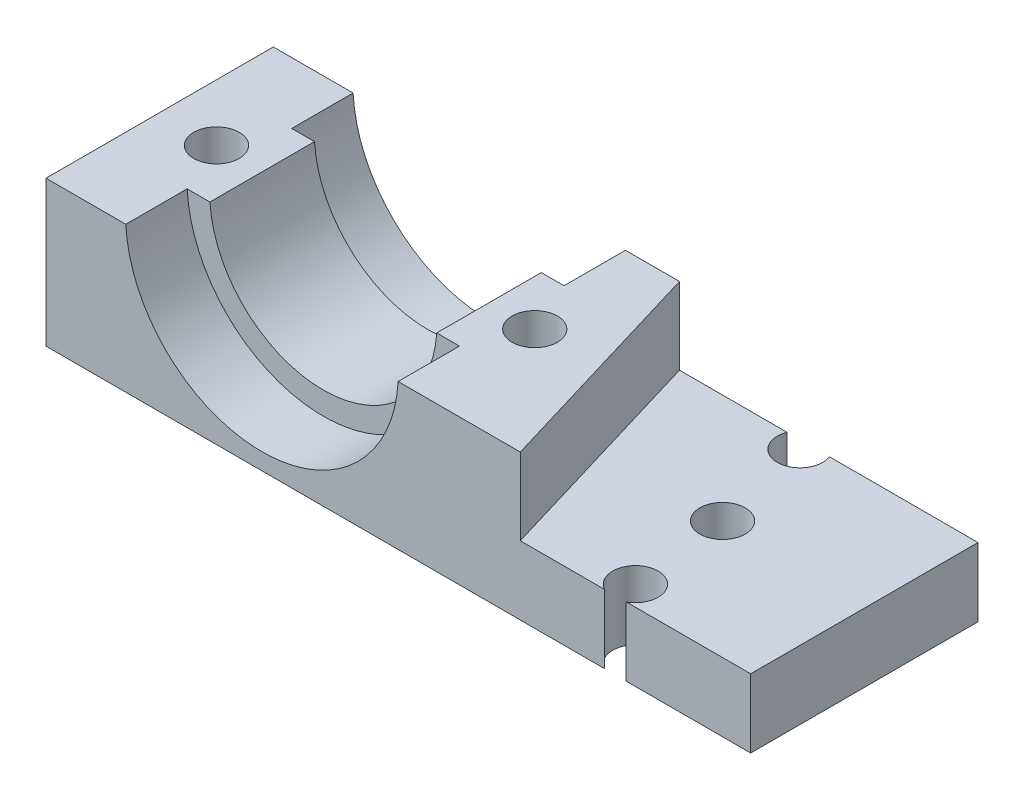
ISO-10303-21;
HEADER;
FILE_DESCRIPTION(('STEP AP214'),'2;1');
FILE_NAME('part.step','',(''),(''),'','','');
FILE_SCHEMA(('AUTOMOTIVE_DESIGN { 1 0 10303 214 1 1 1 1 }'));
ENDSEC;
DATA;
#1=APPLICATION_CONTEXT('core data for automotive mechanical design processes');
#2=APPLICATION_PROTOCOL_DEFINITION('international standard','automotive_design',2000,#1);
#3=PRODUCT_CONTEXT('',#1,'mechanical');
#4=PRODUCT('Part','Part','',(#3));
#5=PRODUCT_RELATED_PRODUCT_CATEGORY('part','',(#4));
#6=PRODUCT_DEFINITION_FORMATION('','',#4);
#7=PRODUCT_DEFINITION_CONTEXT('part definition',#1,'design');
#8=PRODUCT_DEFINITION('design','',#6,#7);
#9=PRODUCT_DEFINITION_SHAPE('','',#8);
#10=(LENGTH_UNIT() NAMED_UNIT(*) SI_UNIT(.MILLI.,.METRE.));
#11=(NAMED_UNIT(*) PLANE_ANGLE_UNIT() SI_UNIT($,.RADIAN.));
#12=(NAMED_UNIT(*) SI_UNIT($,.STERADIAN.) SOLID_ANGLE_UNIT());
#13=UNCERTAINTY_MEASURE_WITH_UNIT(LENGTH_MEASURE(1.E-05),#10,'distance_accuracy_value','');
#14=(GEOMETRIC_REPRESENTATION_CONTEXT(3) GLOBAL_UNCERTAINTY_ASSIGNED_CONTEXT((#13)) GLOBAL_UNIT_ASSIGNED_CONTEXT((#10,
#11,#12)) REPRESENTATION_CONTEXT('',''));
#15=CARTESIAN_POINT('',(0.,0.,0.));
#16=DIRECTION('',(0.,0.,1.));
#17=DIRECTION('',(1.,0.,0.));
#18=AXIS2_PLACEMENT_3D('',#15,#16,#17);
#19=CARTESIAN_POINT('',(47.5,16.,-25.));
#20=DIRECTION('',(0.,0.,1.));
#21=DIRECTION('',(0.,-1.,0.));
#22=AXIS2_PLACEMENT_3D('',#19,#20,#21);
#23=PLANE('',#22);
#24=DIRECTION('',(-1.,0.,0.));
#25=VECTOR('',#24,1.);
#26=CARTESIAN_POINT('',(47.5,-0.899999999999998,-25.));
#27=LINE('',#26,#25);
#28=CARTESIAN_POINT('',(107.5,-0.899999999999998,-25.));
#29=VERTEX_POINT('',#28);
#30=CARTESIAN_POINT('',(74.8242576944994,-0.899999999999998,-25.));
#31=VERTEX_POINT('',#30);
#32=EDGE_CURVE('E50',#29,#31,#27,.T.);
#33=ORIENTED_EDGE('',*,*,#32,.F.);
#34=DIRECTION('',(0.,1.,0.));
#35=VECTOR('',#34,1.);
#36=CARTESIAN_POINT('',(107.5,-16.,-25.));
#37=LINE('',#36,#35);
#38=CARTESIAN_POINT('',(107.5,-16.,-25.));
#39=VERTEX_POINT('',#38);
#40=EDGE_CURVE('E270',#39,#29,#37,.T.);
#41=ORIENTED_EDGE('',*,*,#40,.F.);
#42=DIRECTION('',(-1.,0.,0.));
#43=VECTOR('',#42,1.);
#44=CARTESIAN_POINT('',(47.5,-16.,-25.));
#45=LINE('',#44,#43);
#46=CARTESIAN_POINT('',(74.8242576944994,-16.,-25.));
#47=VERTEX_POINT('',#46);
#48=EDGE_CURVE('E171',#39,#47,#45,.T.);
#49=ORIENTED_EDGE('',*,*,#48,.T.);
#50=DIRECTION('',(0.,1.,0.));
#51=VECTOR('',#50,1.);
#52=CARTESIAN_POINT('',(74.8242576944994,-59.,-25.));
#53=LINE('',#52,#51);
#54=EDGE_CURVE('E219',#47,#31,#53,.T.);
#55=ORIENTED_EDGE('',*,*,#54,.T.);
#56=EDGE_LOOP('',(#33,#41,#49,#55));
#57=FACE_BOUND('',#56,.T.);
#58=ADVANCED_FACE('F35',(#57),#23,.F.);
#59=CARTESIAN_POINT('',(47.5,16.,25.));
#60=DIRECTION('',(0.,0.,-1.));
#61=DIRECTION('',(0.,1.,0.));
#62=AXIS2_PLACEMENT_3D('',#59,#60,#61);
#63=PLANE('',#62);
#64=DIRECTION('',(1.,0.,0.));
#65=VECTOR('',#64,1.);
#66=CARTESIAN_POINT('',(47.5,-0.899999999999998,25.));
#67=LINE('',#66,#65);
#68=CARTESIAN_POINT('',(80.1248684174076,-0.899999999999998,25.));
#69=VERTEX_POINT('',#68);
#70=CARTESIAN_POINT('',(107.5,-0.899999999999998,25.));
#71=VERTEX_POINT('',#70);
#72=EDGE_CURVE('E297',#69,#71,#67,.T.);
#73=ORIENTED_EDGE('',*,*,#72,.F.);
#74=DIRECTION('',(0.,1.,0.));
#75=VECTOR('',#74,1.);
#76=CARTESIAN_POINT('',(80.1248684174076,-59.,25.));
#77=LINE('',#76,#75);
#78=CARTESIAN_POINT('',(80.1248684174076,-16.,25.));
#79=VERTEX_POINT('',#78);
#80=EDGE_CURVE('E216',#69,#79,#77,.F.);
#81=ORIENTED_EDGE('',*,*,#80,.T.);
#82=DIRECTION('',(-1.,0.,0.));
#83=VECTOR('',#82,1.);
#84=CARTESIAN_POINT('',(47.5,-16.,25.));
#85=LINE('',#84,#83);
#86=CARTESIAN_POINT('',(107.5,-16.,25.));
#87=VERTEX_POINT('',#86);
#88=EDGE_CURVE('E178',#87,#79,#85,.T.);
#89=ORIENTED_EDGE('',*,*,#88,.F.);
#90=DIRECTION('',(0.,-1.,0.));
#91=VECTOR('',#90,1.);
#92=CARTESIAN_POINT('',(107.5,16.,25.));
#93=LINE('',#92,#91);
#94=EDGE_CURVE('E276',#71,#87,#93,.T.);
#95=ORIENTED_EDGE('',*,*,#94,.F.);
#96=EDGE_LOOP('',(#73,#81,#89,#95));
#97=FACE_BOUND('',#96,.T.);
#98=ADVANCED_FACE('F37',(#97),#63,.F.);
#99=CARTESIAN_POINT('',(107.5,0.,0.));
#100=DIRECTION('',(1.,0.,0.));
#101=DIRECTION('',(0.,0.,-1.));
#102=AXIS2_PLACEMENT_3D('',#99,#100,#101);
#103=PLANE('',#102);
#104=ORIENTED_EDGE('',*,*,#40,.T.);
#105=DIRECTION('',(0.,0.,1.));
#106=VECTOR('',#105,1.);
#107=CARTESIAN_POINT('',(107.5,-0.899999999999998,0.));
#108=LINE('',#107,#106);
#109=EDGE_CURVE('E299',#29,#71,#108,.T.);
#110=ORIENTED_EDGE('',*,*,#109,.T.);
#111=ORIENTED_EDGE('',*,*,#94,.T.);
#112=DIRECTION('',(0.,0.,-1.));
#113=VECTOR('',#112,1.);
#114=CARTESIAN_POINT('',(107.5,-16.,25.));
#115=LINE('',#114,#113);
#116=EDGE_CURVE('E273',#87,#39,#115,.T.);
#117=ORIENTED_EDGE('',*,*,#116,.T.);
#118=EDGE_LOOP('',(#104,#110,#111,#117));
#119=FACE_BOUND('',#118,.T.);
#120=ADVANCED_FACE('F318',(#119),#103,.T.);
#121=CARTESIAN_POINT('',(77.75,-59.,20.6));
#122=DIRECTION('',(0.,1.,0.));
#123=DIRECTION('',(0.,0.,1.));
#124=AXIS2_PLACEMENT_3D('',#121,#122,#123);
#125=CYLINDRICAL_SURFACE('',#124,5.);
#126=CARTESIAN_POINT('',(77.75,-0.899999999999998,20.6));
#127=DIRECTION('',(0.,1.,0.));
#128=DIRECTION('',(0.,0.,1.));
#129=AXIS2_PLACEMENT_3D('',#126,#127,#128);
#130=CIRCLE('',#129,5.);
#131=CARTESIAN_POINT('',(75.3751315825924,-0.899999999999998,25.));
#132=VERTEX_POINT('',#131);
#133=EDGE_CURVE('E295',#132,#69,#130,.F.);
#134=ORIENTED_EDGE('',*,*,#133,.F.);
#135=DIRECTION('',(0.,1.,0.));
#136=VECTOR('',#135,1.);
#137=CARTESIAN_POINT('',(75.3751315825924,-59.,25.));
#138=LINE('',#137,#136);
#139=CARTESIAN_POINT('',(75.3751315825924,-16.,25.));
#140=VERTEX_POINT('',#139);
#141=EDGE_CURVE('E285',#140,#132,#138,.T.);
#142=ORIENTED_EDGE('',*,*,#141,.F.);
#143=CARTESIAN_POINT('',(77.75,-16.,20.6));
#144=DIRECTION('',(0.,1.,0.));
#145=DIRECTION('',(0.,0.,1.));
#146=AXIS2_PLACEMENT_3D('',#143,#144,#145);
#147=CIRCLE('',#146,5.);
#148=EDGE_CURVE('E205',#79,#140,#147,.T.);
#149=ORIENTED_EDGE('',*,*,#148,.F.);
#150=ORIENTED_EDGE('',*,*,#80,.F.);
#151=EDGE_LOOP('',(#134,#142,#149,#150));
#152=FACE_BOUND('',#151,.T.);
#153=ADVANCED_FACE('F310',(#152),#125,.F.);
#154=CARTESIAN_POINT('',(75.2958783952514,-59.,-1.01110333021213));
#155=DIRECTION('',(0.,1.,0.));
#156=DIRECTION('',(0.,0.,1.));
#157=AXIS2_PLACEMENT_3D('',#154,#155,#156);
#158=CYLINDRICAL_SURFACE('',#157,5.);
#159=CARTESIAN_POINT('',(75.2958783952514,-16.,-1.01110333021213));
#160=DIRECTION('',(0.,1.,0.));
#161=DIRECTION('',(0.,0.,1.));
#162=AXIS2_PLACEMENT_3D('',#159,#160,#161);
#163=CIRCLE('',#162,5.);
#164=CARTESIAN_POINT('',(75.2958783952514,-16.,3.98889666978787));
#165=VERTEX_POINT('',#164);
#166=EDGE_CURVE('E213',#165,#165,#163,.T.);
#167=ORIENTED_EDGE('',*,*,#166,.F.);
#168=EDGE_LOOP('',(#167));
#169=FACE_BOUND('',#168,.T.);
#170=CARTESIAN_POINT('',(75.2958783952514,-0.899999999999998,-1.01110333021213));
#171=DIRECTION('',(0.,1.,0.));
#172=DIRECTION('',(0.,0.,1.));
#173=AXIS2_PLACEMENT_3D('',#170,#171,#172);
#174=CIRCLE('',#173,5.);
#175=CARTESIAN_POINT('',(75.2958783952514,-0.899999999999998,3.98889666978787));
#176=VERTEX_POINT('',#175);
#177=EDGE_CURVE('E290',#176,#176,#174,.F.);
#178=ORIENTED_EDGE('',*,*,#177,.F.);
#179=EDGE_LOOP('',(#178));
#180=FACE_BOUND('',#179,.T.);
#181=ADVANCED_FACE('F457',(#169,#180),#158,.F.);
#182=CARTESIAN_POINT('',(70.16399597534,-59.,-23.1883817430436));
#183=DIRECTION('',(0.,1.,0.));
#184=DIRECTION('',(0.,0.,1.));
#185=AXIS2_PLACEMENT_3D('',#182,#183,#184);
#186=CYLINDRICAL_SURFACE('',#185,5.);
#187=CARTESIAN_POINT('',(70.16399597534,-0.899999999999998,-23.1883817430436));
#188=DIRECTION('',(0.,1.,0.));
#189=DIRECTION('',(0.,0.,1.));
#190=AXIS2_PLACEMENT_3D('',#187,#188,#189);
#191=CIRCLE('',#190,5.);
#192=CARTESIAN_POINT('',(65.5037342561806,-0.899999999999998,-25.));
#193=VERTEX_POINT('',#192);
#194=EDGE_CURVE('E43',#31,#193,#191,.F.);
#195=ORIENTED_EDGE('',*,*,#194,.F.);
#196=ORIENTED_EDGE('',*,*,#54,.F.);
#197=CARTESIAN_POINT('',(70.16399597534,-16.,-23.1883817430436));
#198=DIRECTION('',(0.,1.,0.));
#199=DIRECTION('',(0.,0.,1.));
#200=AXIS2_PLACEMENT_3D('',#197,#198,#199);
#201=CIRCLE('',#200,5.);
#202=CARTESIAN_POINT('',(65.5037342561806,-16.,-25.));
#203=VERTEX_POINT('',#202);
#204=EDGE_CURVE('E217',#203,#47,#201,.T.);
#205=ORIENTED_EDGE('',*,*,#204,.F.);
#206=DIRECTION('',(0.,1.,0.));
#207=VECTOR('',#206,1.);
#208=CARTESIAN_POINT('',(65.5037342561806,-59.,-25.));
#209=LINE('',#208,#207);
#210=EDGE_CURVE('E58',#193,#203,#209,.F.);
#211=ORIENTED_EDGE('',*,*,#210,.F.);
#212=EDGE_LOOP('',(#195,#196,#205,#211));
#213=FACE_BOUND('',#212,.T.);
#214=ADVANCED_FACE('F226',(#213),#186,.F.);
#215=DIRECTION('',(1.,0.,0.));
#216=VECTOR('',#215,1.);
#217=CARTESIAN_POINT('',(47.5,-0.899999999999998,25.));
#218=LINE('',#217,#216);
#219=CARTESIAN_POINT('',(56.8274489065329,-0.899999999999998,25.));
#220=VERTEX_POINT('',#219);
#221=EDGE_CURVE('E293',#220,#132,#218,.T.);
#222=ORIENTED_EDGE('',*,*,#221,.F.);
#223=DIRECTION('',(0.,1.,0.));
#224=VECTOR('',#223,1.);
#225=CARTESIAN_POINT('',(56.8274489065329,16.,25.));
#226=LINE('',#225,#224);
#227=CARTESIAN_POINT('',(56.8274489065329,16.,25.));
#228=VERTEX_POINT('',#227);
#229=EDGE_CURVE('E230',#220,#228,#226,.T.);
#230=ORIENTED_EDGE('',*,*,#229,.T.);
#231=DIRECTION('',(-1.,0.,0.));
#232=VECTOR('',#231,1.);
#233=CARTESIAN_POINT('',(47.5,16.,25.));
#234=LINE('',#233,#232);
#235=CARTESIAN_POINT('',(29.9545906331567,16.,25.));
#236=VERTEX_POINT('',#235);
#237=EDGE_CURVE('E162',#228,#236,#234,.T.);
#238=ORIENTED_EDGE('',*,*,#237,.T.);
#239=CARTESIAN_POINT('',(0.,17.6500000000001,25.));
#240=DIRECTION('',(0.,0.,1.));
#241=DIRECTION('',(1.,0.,0.));
#242=AXIS2_PLACEMENT_3D('',#239,#240,#241);
#243=CIRCLE('',#242,30.);
#244=CARTESIAN_POINT('',(-29.9545906331567,16.,25.));
#245=VERTEX_POINT('',#244);
#246=EDGE_CURVE('E254',#245,#236,#243,.T.);
#247=ORIENTED_EDGE('',*,*,#246,.F.);
#248=CARTESIAN_POINT('',(-47.5,16.,25.));
#249=VERTEX_POINT('',#248);
#250=EDGE_CURVE('E250',#245,#249,#234,.T.);
#251=ORIENTED_EDGE('',*,*,#250,.T.);
#252=DIRECTION('',(0.,-1.,0.));
#253=VECTOR('',#252,1.);
#254=CARTESIAN_POINT('',(-47.5,16.,25.));
#255=LINE('',#254,#253);
#256=CARTESIAN_POINT('',(-47.5,-16.,25.));
#257=VERTEX_POINT('',#256);
#258=EDGE_CURVE('E247',#249,#257,#255,.T.);
#259=ORIENTED_EDGE('',*,*,#258,.T.);
#260=EDGE_CURVE('E177',#140,#257,#85,.T.);
#261=ORIENTED_EDGE('',*,*,#260,.F.);
#262=ORIENTED_EDGE('',*,*,#141,.T.);
#263=EDGE_LOOP('',(#222,#230,#238,#247,#251,#259,#261,#262));
#264=FACE_BOUND('',#263,.T.);
#265=ADVANCED_FACE('F306',(#264),#63,.F.);
#266=CARTESIAN_POINT('',(47.5,16.,25.));
#267=DIRECTION('',(0.,-1.,0.));
#268=DIRECTION('',(0.,0.,-1.));
#269=AXIS2_PLACEMENT_3D('',#266,#267,#268);
#270=PLANE('',#269);
#271=CARTESIAN_POINT('',(35.,16.,0.));
#272=DIRECTION('',(0.,1.,0.));
#273=DIRECTION('',(0.,0.,1.));
#274=AXIS2_PLACEMENT_3D('',#271,#272,#273);
#275=CIRCLE('',#274,5.);
#276=CARTESIAN_POINT('',(35.,16.,4.99999999999998));
#277=VERTEX_POINT('',#276);
#278=EDGE_CURVE('E210',#277,#277,#275,.T.);
#279=ORIENTED_EDGE('',*,*,#278,.F.);
#280=EDGE_LOOP('',(#279));
#281=FACE_BOUND('',#280,.T.);
#282=ORIENTED_EDGE('',*,*,#237,.F.);
#283=DIRECTION('',(0.287073177950389,0.,0.957908654570708));
#284=VECTOR('',#283,1.);
#285=CARTESIAN_POINT('',(97.4111695597761,16.,160.420165429526));
#286=LINE('',#285,#284);
#287=CARTESIAN_POINT('',(41.8430776629595,16.,-25.));
#288=VERTEX_POINT('',#287);
#289=EDGE_CURVE('E150',#288,#228,#286,.T.);
#290=ORIENTED_EDGE('',*,*,#289,.F.);
#291=DIRECTION('',(-1.,0.,0.));
#292=VECTOR('',#291,1.);
#293=CARTESIAN_POINT('',(47.5,16.,-25.));
#294=LINE('',#293,#292);
#295=CARTESIAN_POINT('',(29.9545906331567,16.,-25.));
#296=VERTEX_POINT('',#295);
#297=EDGE_CURVE('E159',#288,#296,#294,.T.);
#298=ORIENTED_EDGE('',*,*,#297,.T.);
#299=DIRECTION('',(0.,0.,1.));
#300=VECTOR('',#299,1.);
#301=CARTESIAN_POINT('',(29.9545906331567,16.,-20.2491264575217));
#302=LINE('',#301,#300);
#303=CARTESIAN_POINT('',(29.9545906331567,16.,-11.5));
#304=VERTEX_POINT('',#303);
#305=EDGE_CURVE('E198',#296,#304,#302,.T.);
#306=ORIENTED_EDGE('',*,*,#305,.T.);
#307=DIRECTION('',(-1.,0.,0.));
#308=VECTOR('',#307,1.);
#309=CARTESIAN_POINT('',(47.5,16.,-11.5));
#310=LINE('',#309,#308);
#311=CARTESIAN_POINT('',(24.9454905744505,16.,-11.5));
#312=VERTEX_POINT('',#311);
#313=EDGE_CURVE('E188',#304,#312,#310,.T.);
#314=ORIENTED_EDGE('',*,*,#313,.T.);
#315=DIRECTION('',(0.,0.,1.));
#316=VECTOR('',#315,1.);
#317=CARTESIAN_POINT('',(24.9454905744505,16.,-20.2491264575217));
#318=LINE('',#317,#316);
#319=CARTESIAN_POINT('',(24.9454905744505,16.,11.5));
#320=VERTEX_POINT('',#319);
#321=EDGE_CURVE('E200',#312,#320,#318,.T.);
#322=ORIENTED_EDGE('',*,*,#321,.T.);
#323=DIRECTION('',(1.,0.,0.));
#324=VECTOR('',#323,1.);
#325=CARTESIAN_POINT('',(47.5,16.,11.5));
#326=LINE('',#325,#324);
#327=CARTESIAN_POINT('',(29.9545906331567,16.,11.5));
#328=VERTEX_POINT('',#327);
#329=EDGE_CURVE('E195',#320,#328,#326,.T.);
#330=ORIENTED_EDGE('',*,*,#329,.T.);
#331=DIRECTION('',(0.,0.,1.));
#332=VECTOR('',#331,1.);
#333=CARTESIAN_POINT('',(29.9545906331567,16.,-20.2491264575217));
#334=LINE('',#333,#332);
#335=EDGE_CURVE('E203',#328,#236,#334,.T.);
#336=ORIENTED_EDGE('',*,*,#335,.T.);
#337=EDGE_LOOP('',(#282,#290,#298,#306,#314,#322,#330,#336));
#338=FACE_BOUND('',#337,.T.);
#339=ADVANCED_FACE('F157',(#281,#338),#270,.F.);
#340=CARTESIAN_POINT('',(47.5,-16.,25.));
#341=DIRECTION('',(0.,1.,0.));
#342=DIRECTION('',(0.,0.,1.));
#343=AXIS2_PLACEMENT_3D('',#340,#341,#342);
#344=PLANE('',#343);
#345=ORIENTED_EDGE('',*,*,#166,.T.);
#346=EDGE_LOOP('',(#345));
#347=FACE_BOUND('',#346,.T.);
#348=CARTESIAN_POINT('',(35.,-16.,0.));
#349=DIRECTION('',(0.,1.,0.));
#350=DIRECTION('',(0.,0.,1.));
#351=AXIS2_PLACEMENT_3D('',#348,#349,#350);
#352=CIRCLE('',#351,5.);
#353=CARTESIAN_POINT('',(35.,-16.,4.99999999999998));
#354=VERTEX_POINT('',#353);
#355=EDGE_CURVE('E206',#354,#354,#352,.T.);
#356=ORIENTED_EDGE('',*,*,#355,.T.);
#357=EDGE_LOOP('',(#356));
#358=FACE_BOUND('',#357,.T.);
#359=CARTESIAN_POINT('',(-35.,-16.,0.));
#360=DIRECTION('',(0.,1.,0.));
#361=DIRECTION('',(0.,0.,1.));
#362=AXIS2_PLACEMENT_3D('',#359,#360,#361);
#363=CIRCLE('',#362,5.);
#364=CARTESIAN_POINT('',(-35.,-16.,5.));
#365=VERTEX_POINT('',#364);
#366=EDGE_CURVE('E278',#365,#365,#363,.T.);
#367=ORIENTED_EDGE('',*,*,#366,.T.);
#368=EDGE_LOOP('',(#367));
#369=FACE_BOUND('',#368,.T.);
#370=CARTESIAN_POINT('',(-47.5,-16.,-25.));
#371=VERTEX_POINT('',#370);
#372=EDGE_CURVE('E168',#203,#371,#45,.T.);
#373=ORIENTED_EDGE('',*,*,#372,.F.);
#374=ORIENTED_EDGE('',*,*,#204,.T.);
#375=ORIENTED_EDGE('',*,*,#48,.F.);
#376=ORIENTED_EDGE('',*,*,#116,.F.);
#377=ORIENTED_EDGE('',*,*,#88,.T.);
#378=ORIENTED_EDGE('',*,*,#148,.T.);
#379=ORIENTED_EDGE('',*,*,#260,.T.);
#380=DIRECTION('',(0.,0.,-1.));
#381=VECTOR('',#380,1.);
#382=CARTESIAN_POINT('',(-47.5,-16.,25.));
#383=LINE('',#382,#381);
#384=EDGE_CURVE('E235',#257,#371,#383,.T.);
#385=ORIENTED_EDGE('',*,*,#384,.T.);
#386=EDGE_LOOP('',(#373,#374,#375,#376,#377,#378,#379,#385));
#387=FACE_BOUND('',#386,.T.);
#388=ADVANCED_FACE('F233',(#347,#358,#369,#387),#344,.F.);
#389=ORIENTED_EDGE('',*,*,#297,.F.);
#390=DIRECTION('',(0.,-1.,0.));
#391=VECTOR('',#390,1.);
#392=CARTESIAN_POINT('',(41.8430776629595,16.,-25.));
#393=LINE('',#392,#391);
#394=CARTESIAN_POINT('',(41.8430776629595,-0.899999999999998,-25.));
#395=VERTEX_POINT('',#394);
#396=EDGE_CURVE('E11',#288,#395,#393,.T.);
#397=ORIENTED_EDGE('',*,*,#396,.T.);
#398=DIRECTION('',(-1.,0.,0.));
#399=VECTOR('',#398,1.);
#400=CARTESIAN_POINT('',(47.5,-0.899999999999998,-25.));
#401=LINE('',#400,#399);
#402=EDGE_CURVE('E223',#193,#395,#401,.T.);
#403=ORIENTED_EDGE('',*,*,#402,.F.);
#404=ORIENTED_EDGE('',*,*,#210,.T.);
#405=ORIENTED_EDGE('',*,*,#372,.T.);
#406=DIRECTION('',(0.,1.,0.));
#407=VECTOR('',#406,1.);
#408=CARTESIAN_POINT('',(-47.5,16.,-25.));
#409=LINE('',#408,#407);
#410=CARTESIAN_POINT('',(-47.5,16.,-25.));
#411=VERTEX_POINT('',#410);
#412=EDGE_CURVE('E238',#371,#411,#409,.T.);
#413=ORIENTED_EDGE('',*,*,#412,.T.);
#414=CARTESIAN_POINT('',(-29.9545906331567,16.,-25.));
#415=VERTEX_POINT('',#414);
#416=EDGE_CURVE('E169',#415,#411,#294,.T.);
#417=ORIENTED_EDGE('',*,*,#416,.F.);
#418=CARTESIAN_POINT('',(0.,17.6500000000001,-25.));
#419=DIRECTION('',(0.,0.,1.));
#420=DIRECTION('',(1.,0.,0.));
#421=AXIS2_PLACEMENT_3D('',#418,#419,#420);
#422=CIRCLE('',#421,30.);
#423=EDGE_CURVE('E167',#415,#296,#422,.T.);
#424=ORIENTED_EDGE('',*,*,#423,.T.);
#425=EDGE_LOOP('',(#389,#397,#403,#404,#405,#413,#417,#424));
#426=FACE_BOUND('',#425,.T.);
#427=ADVANCED_FACE('F165',(#426),#23,.F.);
#428=CARTESIAN_POINT('',(-35.,16.,0.));
#429=DIRECTION('',(0.,1.,0.));
#430=DIRECTION('',(0.,0.,1.));
#431=AXIS2_PLACEMENT_3D('',#428,#429,#430);
#432=CIRCLE('',#431,5.);
#433=CARTESIAN_POINT('',(-35.,16.,5.));
#434=VERTEX_POINT('',#433);
#435=EDGE_CURVE('E209',#434,#434,#432,.T.);
#436=ORIENTED_EDGE('',*,*,#435,.F.);
#437=EDGE_LOOP('',(#436));
#438=FACE_BOUND('',#437,.T.);
#439=ORIENTED_EDGE('',*,*,#250,.F.);
#440=DIRECTION('',(0.,0.,1.));
#441=VECTOR('',#440,1.);
#442=CARTESIAN_POINT('',(-29.9545906331567,16.,-20.2491264575217));
#443=LINE('',#442,#441);
#444=CARTESIAN_POINT('',(-29.9545906331567,16.,11.5));
#445=VERTEX_POINT('',#444);
#446=EDGE_CURVE('E194',#245,#445,#443,.F.);
#447=ORIENTED_EDGE('',*,*,#446,.T.);
#448=CARTESIAN_POINT('',(-24.9454905744505,16.,11.5));
#449=VERTEX_POINT('',#448);
#450=EDGE_CURVE('E191',#445,#449,#326,.T.);
#451=ORIENTED_EDGE('',*,*,#450,.T.);
#452=DIRECTION('',(0.,0.,1.));
#453=VECTOR('',#452,1.);
#454=CARTESIAN_POINT('',(-24.9454905744505,16.,-20.2491264575217));
#455=LINE('',#454,#453);
#456=CARTESIAN_POINT('',(-24.9454905744505,16.,-11.5));
#457=VERTEX_POINT('',#456);
#458=EDGE_CURVE('E187',#449,#457,#455,.F.);
#459=ORIENTED_EDGE('',*,*,#458,.T.);
#460=CARTESIAN_POINT('',(-29.9545906331567,16.,-11.5));
#461=VERTEX_POINT('',#460);
#462=EDGE_CURVE('E184',#457,#461,#310,.T.);
#463=ORIENTED_EDGE('',*,*,#462,.T.);
#464=DIRECTION('',(0.,0.,1.));
#465=VECTOR('',#464,1.);
#466=CARTESIAN_POINT('',(-29.9545906331567,16.,-20.2491264575217));
#467=LINE('',#466,#465);
#468=EDGE_CURVE('E181',#461,#415,#467,.F.);
#469=ORIENTED_EDGE('',*,*,#468,.T.);
#470=ORIENTED_EDGE('',*,*,#416,.T.);
#471=DIRECTION('',(0.,0.,1.));
#472=VECTOR('',#471,1.);
#473=CARTESIAN_POINT('',(-47.5,16.,25.));
#474=LINE('',#473,#472);
#475=EDGE_CURVE('E241',#411,#249,#474,.T.);
#476=ORIENTED_EDGE('',*,*,#475,.T.);
#477=EDGE_LOOP('',(#439,#447,#451,#459,#463,#469,#470,#476));
#478=FACE_BOUND('',#477,.T.);
#479=ADVANCED_FACE('F328',(#438,#478),#270,.F.);
#480=CARTESIAN_POINT('',(-47.5,0.,0.));
#481=DIRECTION('',(1.,0.,0.));
#482=DIRECTION('',(0.,0.,-1.));
#483=AXIS2_PLACEMENT_3D('',#480,#481,#482);
#484=PLANE('',#483);
#485=ORIENTED_EDGE('',*,*,#258,.F.);
#486=ORIENTED_EDGE('',*,*,#475,.F.);
#487=ORIENTED_EDGE('',*,*,#412,.F.);
#488=ORIENTED_EDGE('',*,*,#384,.F.);
#489=EDGE_LOOP('',(#485,#486,#487,#488));
#490=FACE_BOUND('',#489,.T.);
#491=ADVANCED_FACE('F245',(#490),#484,.F.);
#492=CARTESIAN_POINT('',(0.,17.6500000000001,-20.2491264575217));
#493=DIRECTION('',(0.,0.,1.));
#494=DIRECTION('',(1.,0.,0.));
#495=AXIS2_PLACEMENT_3D('',#492,#493,#494);
#496=CYLINDRICAL_SURFACE('',#495,30.);
#497=CARTESIAN_POINT('',(0.,17.6500000000001,11.5));
#498=DIRECTION('',(0.,0.,1.));
#499=DIRECTION('',(1.,0.,0.));
#500=AXIS2_PLACEMENT_3D('',#497,#498,#499);
#501=CIRCLE('',#500,30.);
#502=EDGE_CURVE('E257',#445,#328,#501,.T.);
#503=ORIENTED_EDGE('',*,*,#502,.F.);
#504=ORIENTED_EDGE('',*,*,#446,.F.);
#505=ORIENTED_EDGE('',*,*,#246,.T.);
#506=ORIENTED_EDGE('',*,*,#335,.F.);
#507=EDGE_LOOP('',(#503,#504,#505,#506));
#508=FACE_BOUND('',#507,.T.);
#509=ADVANCED_FACE('F374',(#508),#496,.F.);
#510=CARTESIAN_POINT('',(0.,-12.3499999999999,11.5));
#511=DIRECTION('',(0.,0.,-1.));
#512=DIRECTION('',(-1.,0.,0.));
#513=AXIS2_PLACEMENT_3D('',#510,#511,#512);
#514=PLANE('',#513);
#515=ORIENTED_EDGE('',*,*,#502,.T.);
#516=ORIENTED_EDGE('',*,*,#329,.F.);
#517=CARTESIAN_POINT('',(0.,17.6500000000001,11.5));
#518=DIRECTION('',(0.,0.,1.));
#519=DIRECTION('',(1.,0.,0.));
#520=AXIS2_PLACEMENT_3D('',#517,#518,#519);
#521=CIRCLE('',#520,25.);
#522=EDGE_CURVE('E260',#449,#320,#521,.T.);
#523=ORIENTED_EDGE('',*,*,#522,.F.);
#524=ORIENTED_EDGE('',*,*,#450,.F.);
#525=EDGE_LOOP('',(#515,#516,#523,#524));
#526=FACE_BOUND('',#525,.T.);
#527=ADVANCED_FACE('F370',(#526),#514,.F.);
#528=CARTESIAN_POINT('',(0.,17.6500000000001,-20.2491264575217));
#529=DIRECTION('',(0.,0.,1.));
#530=DIRECTION('',(1.,0.,0.));
#531=AXIS2_PLACEMENT_3D('',#528,#529,#530);
#532=CYLINDRICAL_SURFACE('',#531,25.);
#533=CARTESIAN_POINT('',(0.,17.6500000000001,-11.5));
#534=DIRECTION('',(0.,0.,1.));
#535=DIRECTION('',(1.,0.,0.));
#536=AXIS2_PLACEMENT_3D('',#533,#534,#535);
#537=CIRCLE('',#536,25.);
#538=EDGE_CURVE('E263',#457,#312,#537,.T.);
#539=ORIENTED_EDGE('',*,*,#538,.F.);
#540=ORIENTED_EDGE('',*,*,#458,.F.);
#541=ORIENTED_EDGE('',*,*,#522,.T.);
#542=ORIENTED_EDGE('',*,*,#321,.F.);
#543=EDGE_LOOP('',(#539,#540,#541,#542));
#544=FACE_BOUND('',#543,.T.);
#545=ADVANCED_FACE('F366',(#544),#532,.F.);
#546=CARTESIAN_POINT('',(0.,-7.34999999999992,-11.5));
#547=DIRECTION('',(0.,0.,1.));
#548=DIRECTION('',(1.,0.,0.));
#549=AXIS2_PLACEMENT_3D('',#546,#547,#548);
#550=PLANE('',#549);
#551=CARTESIAN_POINT('',(0.,17.6500000000001,-11.5));
#552=DIRECTION('',(0.,0.,1.));
#553=DIRECTION('',(1.,0.,0.));
#554=AXIS2_PLACEMENT_3D('',#551,#552,#553);
#555=CIRCLE('',#554,30.);
#556=EDGE_CURVE('E266',#461,#304,#555,.T.);
#557=ORIENTED_EDGE('',*,*,#556,.F.);
#558=ORIENTED_EDGE('',*,*,#462,.F.);
#559=ORIENTED_EDGE('',*,*,#538,.T.);
#560=ORIENTED_EDGE('',*,*,#313,.F.);
#561=EDGE_LOOP('',(#557,#558,#559,#560));
#562=FACE_BOUND('',#561,.T.);
#563=ADVANCED_FACE('F357',(#562),#550,.F.);
#564=CARTESIAN_POINT('',(0.,17.6500000000001,-20.2491264575217));
#565=DIRECTION('',(0.,0.,1.));
#566=DIRECTION('',(1.,0.,0.));
#567=AXIS2_PLACEMENT_3D('',#564,#565,#566);
#568=CYLINDRICAL_SURFACE('',#567,30.);
#569=ORIENTED_EDGE('',*,*,#423,.F.);
#570=ORIENTED_EDGE('',*,*,#468,.F.);
#571=ORIENTED_EDGE('',*,*,#556,.T.);
#572=ORIENTED_EDGE('',*,*,#305,.F.);
#573=EDGE_LOOP('',(#569,#570,#571,#572));
#574=FACE_BOUND('',#573,.T.);
#575=ADVANCED_FACE('F348',(#574),#568,.F.);
#576=CARTESIAN_POINT('',(-35.,-59.,0.));
#577=DIRECTION('',(0.,1.,0.));
#578=DIRECTION('',(0.,0.,1.));
#579=AXIS2_PLACEMENT_3D('',#576,#577,#578);
#580=CYLINDRICAL_SURFACE('',#579,5.);
#581=ORIENTED_EDGE('',*,*,#435,.T.);
#582=EDGE_LOOP('',(#581));
#583=FACE_BOUND('',#582,.T.);
#584=ORIENTED_EDGE('',*,*,#366,.F.);
#585=EDGE_LOOP('',(#584));
#586=FACE_BOUND('',#585,.T.);
#587=ADVANCED_FACE('F345',(#583,#586),#580,.F.);
#588=CARTESIAN_POINT('',(35.,-59.,0.));
#589=DIRECTION('',(0.,1.,0.));
#590=DIRECTION('',(0.,0.,1.));
#591=AXIS2_PLACEMENT_3D('',#588,#589,#590);
#592=CYLINDRICAL_SURFACE('',#591,5.);
#593=ORIENTED_EDGE('',*,*,#278,.T.);
#594=EDGE_LOOP('',(#593));
#595=FACE_BOUND('',#594,.T.);
#596=ORIENTED_EDGE('',*,*,#355,.F.);
#597=EDGE_LOOP('',(#596));
#598=FACE_BOUND('',#597,.T.);
#599=ADVANCED_FACE('F347',(#595,#598),#592,.F.);
#600=CARTESIAN_POINT('',(97.4111695597761,-0.899999999999998,160.420165429526));
#601=DIRECTION('',(-0.957908654570708,0.,0.287073177950389));
#602=DIRECTION('',(0.287073177950389,0.,0.957908654570708));
#603=AXIS2_PLACEMENT_3D('',#600,#601,#602);
#604=PLANE('',#603);
#605=DIRECTION('',(0.287073177950389,0.,0.957908654570708));
#606=VECTOR('',#605,1.);
#607=CARTESIAN_POINT('',(97.4111695597761,-0.899999999999998,160.420165429526));
#608=LINE('',#607,#606);
#609=EDGE_CURVE('E153',#395,#220,#608,.T.);
#610=ORIENTED_EDGE('',*,*,#609,.F.);
#611=ORIENTED_EDGE('',*,*,#396,.F.);
#612=ORIENTED_EDGE('',*,*,#289,.T.);
#613=ORIENTED_EDGE('',*,*,#229,.F.);
#614=EDGE_LOOP('',(#610,#611,#612,#613));
#615=FACE_BOUND('',#614,.T.);
#616=ADVANCED_FACE('F149',(#615),#604,.F.);
#617=CARTESIAN_POINT('',(0.,-0.899999999999998,0.));
#618=DIRECTION('',(0.,1.,0.));
#619=DIRECTION('',(0.,0.,1.));
#620=AXIS2_PLACEMENT_3D('',#617,#618,#619);
#621=PLANE('',#620);
#622=ORIENTED_EDGE('',*,*,#221,.T.);
#623=ORIENTED_EDGE('',*,*,#133,.T.);
#624=ORIENTED_EDGE('',*,*,#72,.T.);
#625=ORIENTED_EDGE('',*,*,#109,.F.);
#626=ORIENTED_EDGE('',*,*,#32,.T.);
#627=ORIENTED_EDGE('',*,*,#194,.T.);
#628=ORIENTED_EDGE('',*,*,#402,.T.);
#629=ORIENTED_EDGE('',*,*,#609,.T.);
#630=EDGE_LOOP('',(#622,#623,#624,#625,#626,#627,#628,#629));
#631=FACE_BOUND('',#630,.T.);
#632=ORIENTED_EDGE('',*,*,#177,.T.);
#633=EDGE_LOOP('',(#632));
#634=FACE_BOUND('',#633,.T.);
#635=ADVANCED_FACE('F221',(#631,#634),#621,.T.);
#636=CLOSED_SHELL('',(#58,#98,#120,#153,#181,#214,#265,#339,#388,#427,#479,#491,#509,#527,#545,
#563,#575,#587,#599,#616,#635));
#637=MANIFOLD_SOLID_BREP('B2',#636);
#638=ADVANCED_BREP_SHAPE_REPRESENTATION('',(#18,#637),#14);
#639=SHAPE_DEFINITION_REPRESENTATION(#9,#638);
ENDSEC;
END-ISO-10303-21;
